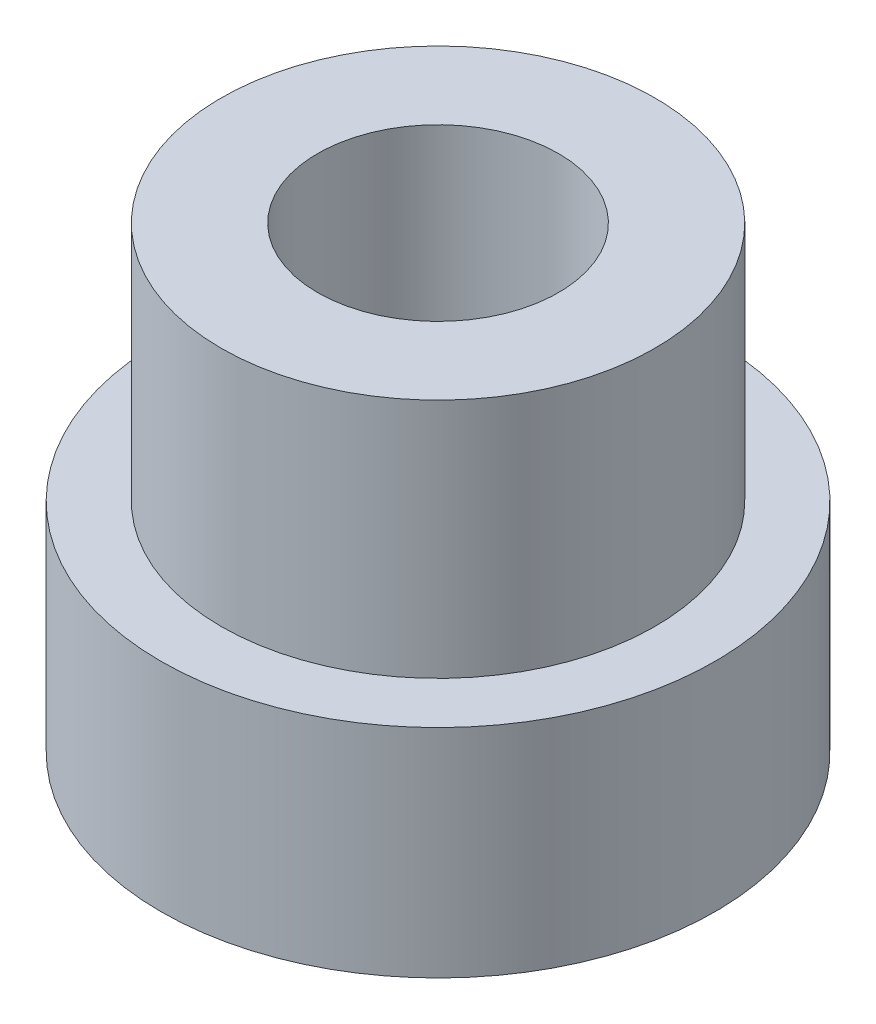
ISO-10303-21;
HEADER;
FILE_DESCRIPTION(('STEP AP214'),'2;1');
FILE_NAME('part.step','',(''),(''),'','','');
FILE_SCHEMA(('AUTOMOTIVE_DESIGN { 1 0 10303 214 1 1 1 1 }'));
ENDSEC;
DATA;
#1=APPLICATION_CONTEXT('core data for automotive mechanical design processes');
#2=APPLICATION_PROTOCOL_DEFINITION('international standard','automotive_design',2000,#1);
#3=PRODUCT_CONTEXT('',#1,'mechanical');
#4=PRODUCT('Part','Part','',(#3));
#5=PRODUCT_RELATED_PRODUCT_CATEGORY('part','',(#4));
#6=PRODUCT_DEFINITION_FORMATION('','',#4);
#7=PRODUCT_DEFINITION_CONTEXT('part definition',#1,'design');
#8=PRODUCT_DEFINITION('design','',#6,#7);
#9=PRODUCT_DEFINITION_SHAPE('','',#8);
#10=(LENGTH_UNIT() NAMED_UNIT(*) SI_UNIT(.MILLI.,.METRE.));
#11=(NAMED_UNIT(*) PLANE_ANGLE_UNIT() SI_UNIT($,.RADIAN.));
#12=(NAMED_UNIT(*) SI_UNIT($,.STERADIAN.) SOLID_ANGLE_UNIT());
#13=UNCERTAINTY_MEASURE_WITH_UNIT(LENGTH_MEASURE(1.E-05),#10,'distance_accuracy_value','');
#14=(GEOMETRIC_REPRESENTATION_CONTEXT(3) GLOBAL_UNCERTAINTY_ASSIGNED_CONTEXT((#13)) GLOBAL_UNIT_ASSIGNED_CONTEXT((#10,
#11,#12)) REPRESENTATION_CONTEXT('',''));
#15=CARTESIAN_POINT('',(0.,0.,0.));
#16=DIRECTION('',(0.,0.,1.));
#17=DIRECTION('',(1.,0.,0.));
#18=AXIS2_PLACEMENT_3D('',#15,#16,#17);
#19=CARTESIAN_POINT('',(0.,18.,0.));
#20=DIRECTION('',(0.,-1.,0.));
#21=DIRECTION('',(0.,0.,-1.));
#22=AXIS2_PLACEMENT_3D('',#19,#20,#21);
#23=CYLINDRICAL_SURFACE('',#22,22.9999999999997);
#24=CARTESIAN_POINT('',(0.,18.,0.));
#25=DIRECTION('',(0.,1.,0.));
#26=DIRECTION('',(0.,0.,1.));
#27=AXIS2_PLACEMENT_3D('',#24,#25,#26);
#28=CIRCLE('',#27,22.9999999999997);
#29=CARTESIAN_POINT('',(0.,18.,22.9999999999997));
#30=VERTEX_POINT('',#29);
#31=EDGE_CURVE('E10',#30,#30,#28,.T.);
#32=ORIENTED_EDGE('',*,*,#31,.F.);
#33=EDGE_LOOP('',(#32));
#34=FACE_BOUND('',#33,.T.);
#35=CARTESIAN_POINT('',(0.,0.,0.));
#36=DIRECTION('',(0.,1.,0.));
#37=DIRECTION('',(0.,0.,1.));
#38=AXIS2_PLACEMENT_3D('',#35,#36,#37);
#39=CIRCLE('',#38,22.9999999999997);
#40=CARTESIAN_POINT('',(0.,0.,22.9999999999997));
#41=VERTEX_POINT('',#40);
#42=EDGE_CURVE('E35',#41,#41,#39,.T.);
#43=ORIENTED_EDGE('',*,*,#42,.T.);
#44=EDGE_LOOP('',(#43));
#45=FACE_BOUND('',#44,.T.);
#46=ADVANCED_FACE('F32',(#34,#45),#23,.T.);
#47=CARTESIAN_POINT('',(0.,18.,0.));
#48=DIRECTION('',(0.,1.,0.));
#49=DIRECTION('',(0.,0.,1.));
#50=AXIS2_PLACEMENT_3D('',#47,#48,#49);
#51=PLANE('',#50);
#52=CARTESIAN_POINT('',(0.,18.,0.));
#53=DIRECTION('',(0.,1.,0.));
#54=DIRECTION('',(0.,0.,1.));
#55=AXIS2_PLACEMENT_3D('',#52,#53,#54);
#56=CIRCLE('',#55,18.0000000000007);
#57=CARTESIAN_POINT('',(0.,18.,18.0000000000007));
#58=VERTEX_POINT('',#57);
#59=EDGE_CURVE('E44',#58,#58,#56,.T.);
#60=ORIENTED_EDGE('',*,*,#59,.F.);
#61=EDGE_LOOP('',(#60));
#62=FACE_BOUND('',#61,.T.);
#63=ORIENTED_EDGE('',*,*,#31,.T.);
#64=EDGE_LOOP('',(#63));
#65=FACE_BOUND('',#64,.T.);
#66=ADVANCED_FACE('F98',(#62,#65),#51,.T.);
#67=CARTESIAN_POINT('',(0.,0.,0.));
#68=DIRECTION('',(0.,1.,0.));
#69=DIRECTION('',(0.,0.,1.));
#70=AXIS2_PLACEMENT_3D('',#67,#68,#69);
#71=PLANE('',#70);
#72=CARTESIAN_POINT('',(0.,0.,0.));
#73=DIRECTION('',(0.,-1.,0.));
#74=DIRECTION('',(0.,0.,-1.));
#75=AXIS2_PLACEMENT_3D('',#72,#73,#74);
#76=CIRCLE('',#75,8.);
#77=CARTESIAN_POINT('',(0.,0.,-8.));
#78=VERTEX_POINT('',#77);
#79=EDGE_CURVE('E50',#78,#78,#76,.T.);
#80=ORIENTED_EDGE('',*,*,#79,.F.);
#81=EDGE_LOOP('',(#80));
#82=FACE_BOUND('',#81,.T.);
#83=ORIENTED_EDGE('',*,*,#42,.F.);
#84=EDGE_LOOP('',(#83));
#85=FACE_BOUND('',#84,.T.);
#86=ADVANCED_FACE('F94',(#82,#85),#71,.F.);
#87=CARTESIAN_POINT('',(0.,38.,0.));
#88=DIRECTION('',(0.,-1.,0.));
#89=DIRECTION('',(0.,0.,-1.));
#90=AXIS2_PLACEMENT_3D('',#87,#88,#89);
#91=CYLINDRICAL_SURFACE('',#90,18.0000000000007);
#92=CARTESIAN_POINT('',(0.,38.,0.));
#93=DIRECTION('',(0.,1.,0.));
#94=DIRECTION('',(0.,0.,1.));
#95=AXIS2_PLACEMENT_3D('',#92,#93,#94);
#96=CIRCLE('',#95,18.0000000000007);
#97=CARTESIAN_POINT('',(0.,38.,18.0000000000007));
#98=VERTEX_POINT('',#97);
#99=EDGE_CURVE('E42',#98,#98,#96,.T.);
#100=ORIENTED_EDGE('',*,*,#99,.F.);
#101=EDGE_LOOP('',(#100));
#102=FACE_BOUND('',#101,.T.);
#103=ORIENTED_EDGE('',*,*,#59,.T.);
#104=EDGE_LOOP('',(#103));
#105=FACE_BOUND('',#104,.T.);
#106=ADVANCED_FACE('F88',(#102,#105),#91,.T.);
#107=CARTESIAN_POINT('',(0.,38.,0.));
#108=DIRECTION('',(0.,1.,0.));
#109=DIRECTION('',(0.,0.,1.));
#110=AXIS2_PLACEMENT_3D('',#107,#108,#109);
#111=PLANE('',#110);
#112=CARTESIAN_POINT('',(0.,38.,0.));
#113=DIRECTION('',(0.,1.,0.));
#114=DIRECTION('',(0.,0.,1.));
#115=AXIS2_PLACEMENT_3D('',#112,#113,#114);
#116=CIRCLE('',#115,10.);
#117=CARTESIAN_POINT('',(0.,38.,10.));
#118=VERTEX_POINT('',#117);
#119=EDGE_CURVE('E56',#118,#118,#116,.T.);
#120=ORIENTED_EDGE('',*,*,#119,.F.);
#121=EDGE_LOOP('',(#120));
#122=FACE_BOUND('',#121,.T.);
#123=ORIENTED_EDGE('',*,*,#99,.T.);
#124=EDGE_LOOP('',(#123));
#125=FACE_BOUND('',#124,.T.);
#126=ADVANCED_FACE('F84',(#122,#125),#111,.T.);
#127=CARTESIAN_POINT('',(0.,8.,0.));
#128=DIRECTION('',(0.,-1.,0.));
#129=DIRECTION('',(0.,0.,-1.));
#130=AXIS2_PLACEMENT_3D('',#127,#128,#129);
#131=CYLINDRICAL_SURFACE('',#130,8.);
#132=CARTESIAN_POINT('',(0.,8.,0.));
#133=DIRECTION('',(0.,-1.,0.));
#134=DIRECTION('',(0.,0.,-1.));
#135=AXIS2_PLACEMENT_3D('',#132,#133,#134);
#136=CIRCLE('',#135,8.);
#137=CARTESIAN_POINT('',(0.,8.,-8.));
#138=VERTEX_POINT('',#137);
#139=EDGE_CURVE('E47',#138,#138,#136,.T.);
#140=ORIENTED_EDGE('',*,*,#139,.F.);
#141=EDGE_LOOP('',(#140));
#142=FACE_BOUND('',#141,.T.);
#143=ORIENTED_EDGE('',*,*,#79,.T.);
#144=EDGE_LOOP('',(#143));
#145=FACE_BOUND('',#144,.T.);
#146=ADVANCED_FACE('F87',(#142,#145),#131,.F.);
#147=CARTESIAN_POINT('',(0.,8.,0.));
#148=DIRECTION('',(0.,-1.,0.));
#149=DIRECTION('',(0.,0.,-1.));
#150=AXIS2_PLACEMENT_3D('',#147,#148,#149);
#151=PLANE('',#150);
#152=CARTESIAN_POINT('',(0.,8.,0.));
#153=DIRECTION('',(0.,-1.,0.));
#154=DIRECTION('',(0.,0.,-1.));
#155=AXIS2_PLACEMENT_3D('',#152,#153,#154);
#156=CIRCLE('',#155,5.);
#157=CARTESIAN_POINT('',(0.,8.,-5.));
#158=VERTEX_POINT('',#157);
#159=EDGE_CURVE('E59',#158,#158,#156,.T.);
#160=ORIENTED_EDGE('',*,*,#159,.F.);
#161=EDGE_LOOP('',(#160));
#162=FACE_BOUND('',#161,.T.);
#163=ORIENTED_EDGE('',*,*,#139,.T.);
#164=EDGE_LOOP('',(#163));
#165=FACE_BOUND('',#164,.T.);
#166=ADVANCED_FACE('F80',(#162,#165),#151,.T.);
#167=CARTESIAN_POINT('',(0.,18.,0.));
#168=DIRECTION('',(0.,1.,0.));
#169=DIRECTION('',(0.,0.,1.));
#170=AXIS2_PLACEMENT_3D('',#167,#168,#169);
#171=CYLINDRICAL_SURFACE('',#170,10.);
#172=CARTESIAN_POINT('',(0.,18.,0.));
#173=DIRECTION('',(0.,1.,0.));
#174=DIRECTION('',(0.,0.,1.));
#175=AXIS2_PLACEMENT_3D('',#172,#173,#174);
#176=CIRCLE('',#175,10.);
#177=CARTESIAN_POINT('',(0.,18.,10.));
#178=VERTEX_POINT('',#177);
#179=EDGE_CURVE('E53',#178,#178,#176,.T.);
#180=ORIENTED_EDGE('',*,*,#179,.F.);
#181=EDGE_LOOP('',(#180));
#182=FACE_BOUND('',#181,.T.);
#183=ORIENTED_EDGE('',*,*,#119,.T.);
#184=EDGE_LOOP('',(#183));
#185=FACE_BOUND('',#184,.T.);
#186=ADVANCED_FACE('F74',(#182,#185),#171,.F.);
#187=CARTESIAN_POINT('',(0.,18.,0.));
#188=DIRECTION('',(0.,1.,0.));
#189=DIRECTION('',(0.,0.,1.));
#190=AXIS2_PLACEMENT_3D('',#187,#188,#189);
#191=PLANE('',#190);
#192=CARTESIAN_POINT('',(0.,18.,0.));
#193=DIRECTION('',(0.,1.,0.));
#194=DIRECTION('',(0.,0.,1.));
#195=AXIS2_PLACEMENT_3D('',#192,#193,#194);
#196=CIRCLE('',#195,5.);
#197=CARTESIAN_POINT('',(0.,18.,5.));
#198=VERTEX_POINT('',#197);
#199=EDGE_CURVE('E64',#198,#198,#196,.T.);
#200=ORIENTED_EDGE('',*,*,#199,.F.);
#201=EDGE_LOOP('',(#200));
#202=FACE_BOUND('',#201,.T.);
#203=ORIENTED_EDGE('',*,*,#179,.T.);
#204=EDGE_LOOP('',(#203));
#205=FACE_BOUND('',#204,.T.);
#206=ADVANCED_FACE('F71',(#202,#205),#191,.T.);
#207=CARTESIAN_POINT('',(0.,18.,0.));
#208=DIRECTION('',(0.,1.,0.));
#209=DIRECTION('',(0.,0.,1.));
#210=AXIS2_PLACEMENT_3D('',#207,#208,#209);
#211=CYLINDRICAL_SURFACE('',#210,5.);
#212=ORIENTED_EDGE('',*,*,#199,.T.);
#213=EDGE_LOOP('',(#212));
#214=FACE_BOUND('',#213,.T.);
#215=ORIENTED_EDGE('',*,*,#159,.T.);
#216=EDGE_LOOP('',(#215));
#217=FACE_BOUND('',#216,.T.);
#218=ADVANCED_FACE('F68',(#214,#217),#211,.F.);
#219=CLOSED_SHELL('',(#46,#66,#86,#106,#126,#146,#166,#186,#206,#218));
#220=MANIFOLD_SOLID_BREP('B2',#219);
#221=ADVANCED_BREP_SHAPE_REPRESENTATION('',(#18,#220),#14);
#222=SHAPE_DEFINITION_REPRESENTATION(#9,#221);
ENDSEC;
END-ISO-10303-21;
